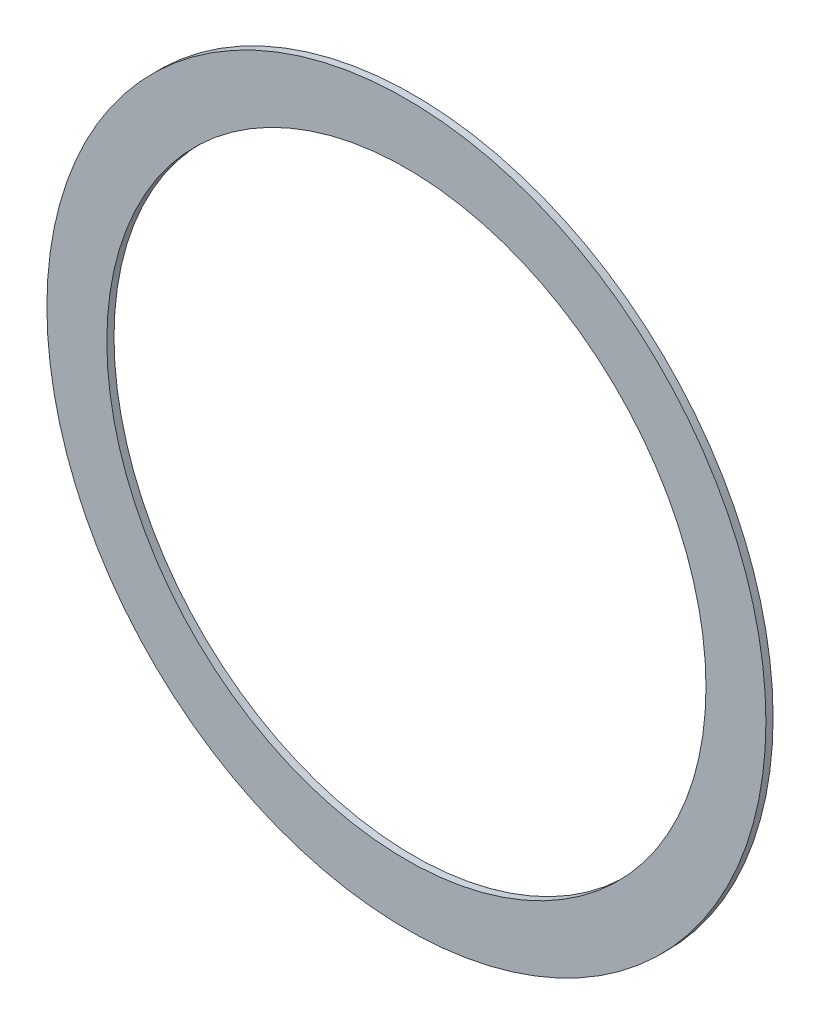
ISO-10303-21;
HEADER;
FILE_DESCRIPTION(('STEP AP214'),'2;1');
FILE_NAME('part.step','',(''),(''),'','','');
FILE_SCHEMA(('AUTOMOTIVE_DESIGN { 1 0 10303 214 1 1 1 1 }'));
ENDSEC;
DATA;
#1=APPLICATION_CONTEXT('core data for automotive mechanical design processes');
#2=APPLICATION_PROTOCOL_DEFINITION('international standard','automotive_design',2000,#1);
#3=PRODUCT_CONTEXT('',#1,'mechanical');
#4=PRODUCT('Part','Part','',(#3));
#5=PRODUCT_RELATED_PRODUCT_CATEGORY('part','',(#4));
#6=PRODUCT_DEFINITION_FORMATION('','',#4);
#7=PRODUCT_DEFINITION_CONTEXT('part definition',#1,'design');
#8=PRODUCT_DEFINITION('design','',#6,#7);
#9=PRODUCT_DEFINITION_SHAPE('','',#8);
#10=(LENGTH_UNIT() NAMED_UNIT(*) SI_UNIT(.MILLI.,.METRE.));
#11=(NAMED_UNIT(*) PLANE_ANGLE_UNIT() SI_UNIT($,.RADIAN.));
#12=(NAMED_UNIT(*) SI_UNIT($,.STERADIAN.) SOLID_ANGLE_UNIT());
#13=UNCERTAINTY_MEASURE_WITH_UNIT(LENGTH_MEASURE(1.E-05),#10,'distance_accuracy_value','');
#14=(GEOMETRIC_REPRESENTATION_CONTEXT(3) GLOBAL_UNCERTAINTY_ASSIGNED_CONTEXT((#13)) GLOBAL_UNIT_ASSIGNED_CONTEXT((#10,
#11,#12)) REPRESENTATION_CONTEXT('',''));
#15=CARTESIAN_POINT('',(0.,0.,0.));
#16=DIRECTION('',(0.,0.,1.));
#17=DIRECTION('',(1.,0.,0.));
#18=AXIS2_PLACEMENT_3D('',#15,#16,#17);
#19=CARTESIAN_POINT('',(0.,0.,0.381));
#20=DIRECTION('',(0.,0.,1.));
#21=DIRECTION('',(1.,0.,0.));
#22=AXIS2_PLACEMENT_3D('',#19,#20,#21);
#23=PLANE('',#22);
#24=CARTESIAN_POINT('',(0.,0.,0.381));
#25=DIRECTION('',(0.,0.,1.));
#26=DIRECTION('',(1.,0.,0.));
#27=AXIS2_PLACEMENT_3D('',#24,#25,#26);
#28=CIRCLE('',#27,19.05);
#29=CARTESIAN_POINT('',(-19.05,0.,0.381));
#30=VERTEX_POINT('',#29);
#31=EDGE_CURVE('E10',#30,#30,#28,.T.);
#32=ORIENTED_EDGE('',*,*,#31,.T.);
#33=EDGE_LOOP('',(#32));
#34=FACE_BOUND('',#33,.T.);
#35=CARTESIAN_POINT('',(0.,0.,0.381));
#36=DIRECTION('',(0.,0.,1.));
#37=DIRECTION('',(1.,0.,0.));
#38=AXIS2_PLACEMENT_3D('',#35,#36,#37);
#39=CIRCLE('',#38,15.875);
#40=CARTESIAN_POINT('',(-15.875,0.,0.381));
#41=VERTEX_POINT('',#40);
#42=EDGE_CURVE('E41',#41,#41,#39,.T.);
#43=ORIENTED_EDGE('',*,*,#42,.F.);
#44=EDGE_LOOP('',(#43));
#45=FACE_BOUND('',#44,.T.);
#46=ADVANCED_FACE('F30',(#34,#45),#23,.T.);
#47=CARTESIAN_POINT('',(0.,0.,0.));
#48=DIRECTION('',(0.,0.,1.));
#49=DIRECTION('',(1.,0.,0.));
#50=AXIS2_PLACEMENT_3D('',#47,#48,#49);
#51=PLANE('',#50);
#52=CARTESIAN_POINT('',(0.,0.,0.));
#53=DIRECTION('',(0.,0.,1.));
#54=DIRECTION('',(1.,0.,0.));
#55=AXIS2_PLACEMENT_3D('',#52,#53,#54);
#56=CIRCLE('',#55,19.05);
#57=CARTESIAN_POINT('',(-19.05,0.,0.));
#58=VERTEX_POINT('',#57);
#59=EDGE_CURVE('E34',#58,#58,#56,.T.);
#60=ORIENTED_EDGE('',*,*,#59,.F.);
#61=EDGE_LOOP('',(#60));
#62=FACE_BOUND('',#61,.T.);
#63=CARTESIAN_POINT('',(0.,0.,0.));
#64=DIRECTION('',(0.,0.,1.));
#65=DIRECTION('',(1.,0.,0.));
#66=AXIS2_PLACEMENT_3D('',#63,#64,#65);
#67=CIRCLE('',#66,15.875);
#68=CARTESIAN_POINT('',(-15.875,0.,0.));
#69=VERTEX_POINT('',#68);
#70=EDGE_CURVE('E43',#69,#69,#67,.T.);
#71=ORIENTED_EDGE('',*,*,#70,.T.);
#72=EDGE_LOOP('',(#71));
#73=FACE_BOUND('',#72,.T.);
#74=ADVANCED_FACE('F53',(#62,#73),#51,.F.);
#75=CARTESIAN_POINT('',(0.,0.,0.381));
#76=DIRECTION('',(0.,0.,-1.));
#77=DIRECTION('',(-1.,0.,0.));
#78=AXIS2_PLACEMENT_3D('',#75,#76,#77);
#79=CYLINDRICAL_SURFACE('',#78,19.05);
#80=CARTESIAN_POINT('',(-19.05,0.,0.381));
#81=CARTESIAN_POINT('',(-19.05,0.,0.37703125));
#82=CARTESIAN_POINT('',(-19.05,0.,0.3730625));
#83=CARTESIAN_POINT('',(-19.05,0.,0.365125));
#84=CARTESIAN_POINT('',(-19.05,0.,0.36115625));
#85=CARTESIAN_POINT('',(-19.05,0.,0.35321875));
#86=CARTESIAN_POINT('',(-19.05,0.,0.34925));
#87=CARTESIAN_POINT('',(-19.05,0.,0.3413125));
#88=CARTESIAN_POINT('',(-19.05,0.,0.33734375));
#89=CARTESIAN_POINT('',(-19.05,0.,0.32940625));
#90=CARTESIAN_POINT('',(-19.05,0.,0.3254375));
#91=CARTESIAN_POINT('',(-19.05,0.,0.3175));
#92=CARTESIAN_POINT('',(-19.05,0.,0.31353125));
#93=CARTESIAN_POINT('',(-19.05,0.,0.30559375));
#94=CARTESIAN_POINT('',(-19.05,0.,0.301625));
#95=CARTESIAN_POINT('',(-19.05,0.,0.2936875));
#96=CARTESIAN_POINT('',(-19.05,0.,0.28971875));
#97=CARTESIAN_POINT('',(-19.05,0.,0.28178125));
#98=CARTESIAN_POINT('',(-19.05,0.,0.2778125));
#99=CARTESIAN_POINT('',(-19.05,0.,0.269875));
#100=CARTESIAN_POINT('',(-19.05,0.,0.26590625));
#101=CARTESIAN_POINT('',(-19.05,0.,0.25796875));
#102=CARTESIAN_POINT('',(-19.05,0.,0.254));
#103=CARTESIAN_POINT('',(-19.05,0.,0.2460625));
#104=CARTESIAN_POINT('',(-19.05,0.,0.24209375));
#105=CARTESIAN_POINT('',(-19.05,0.,0.23415625));
#106=CARTESIAN_POINT('',(-19.05,0.,0.2301875));
#107=CARTESIAN_POINT('',(-19.05,0.,0.22225));
#108=CARTESIAN_POINT('',(-19.05,0.,0.21828125));
#109=CARTESIAN_POINT('',(-19.05,0.,0.21034375));
#110=CARTESIAN_POINT('',(-19.05,0.,0.206375));
#111=CARTESIAN_POINT('',(-19.05,0.,0.1984375));
#112=CARTESIAN_POINT('',(-19.05,0.,0.19446875));
#113=CARTESIAN_POINT('',(-19.05,0.,0.18653125));
#114=CARTESIAN_POINT('',(-19.05,0.,0.1825625));
#115=CARTESIAN_POINT('',(-19.05,0.,0.174625));
#116=CARTESIAN_POINT('',(-19.05,0.,0.17065625));
#117=CARTESIAN_POINT('',(-19.05,0.,0.16271875));
#118=CARTESIAN_POINT('',(-19.05,0.,0.15875));
#119=CARTESIAN_POINT('',(-19.05,0.,0.1508125));
#120=CARTESIAN_POINT('',(-19.05,0.,0.14684375));
#121=CARTESIAN_POINT('',(-19.05,0.,0.13890625));
#122=CARTESIAN_POINT('',(-19.05,0.,0.1349375));
#123=CARTESIAN_POINT('',(-19.05,0.,0.127));
#124=CARTESIAN_POINT('',(-19.05,0.,0.12303125));
#125=CARTESIAN_POINT('',(-19.05,0.,0.11509375));
#126=CARTESIAN_POINT('',(-19.05,0.,0.111125));
#127=CARTESIAN_POINT('',(-19.05,0.,0.1031875));
#128=CARTESIAN_POINT('',(-19.05,0.,0.09921875));
#129=CARTESIAN_POINT('',(-19.05,0.,0.09128125));
#130=CARTESIAN_POINT('',(-19.05,0.,0.0873125));
#131=CARTESIAN_POINT('',(-19.05,0.,0.079375));
#132=CARTESIAN_POINT('',(-19.05,0.,0.07540625));
#133=CARTESIAN_POINT('',(-19.05,0.,0.06746875));
#134=CARTESIAN_POINT('',(-19.05,0.,0.0635));
#135=CARTESIAN_POINT('',(-19.05,0.,0.0555625));
#136=CARTESIAN_POINT('',(-19.05,0.,0.05159375));
#137=CARTESIAN_POINT('',(-19.05,0.,0.04365625));
#138=CARTESIAN_POINT('',(-19.05,0.,0.0396875));
#139=CARTESIAN_POINT('',(-19.05,0.,0.03175));
#140=CARTESIAN_POINT('',(-19.05,0.,0.02778125));
#141=CARTESIAN_POINT('',(-19.05,0.,0.01984375));
#142=CARTESIAN_POINT('',(-19.05,0.,0.015875));
#143=CARTESIAN_POINT('',(-19.05,0.,0.00793749999999999));
#144=CARTESIAN_POINT('',(-19.05,0.,0.00396874999999999));
#145=CARTESIAN_POINT('',(-19.05,0.,0.));
#146=B_SPLINE_CURVE_WITH_KNOTS('',3,(#80,#81,#82,#83,#84,#85,#86,#87,#88,#89,#90,#91,#92,#93,
#94,#95,#96,#97,#98,#99,#100,#101,#102,#103,#104,#105,#106,#107,#108,#109,#110,#111,#112,#113,
#114,#115,#116,#117,#118,#119,#120,#121,#122,#123,#124,#125,#126,#127,#128,#129,#130,#131,#132,
#133,#134,#135,#136,#137,#138,#139,#140,#141,#142,#143,#144,#145),.UNSPECIFIED.,.F.,.F.,(4,2,2,
2,2,2,2,2,2,2,2,2,2,2,2,2,2,2,2,2,2,2,2,2,2,2,2,2,2,2,2,2,4),(0.,0.01190625,0.0238125,
0.0357187499999999,0.047625,0.05953125,0.0714374999999999,0.08334375,0.09525,0.10715625,
0.1190625,0.13096875,0.142875,0.15478125,0.1666875,0.17859375,0.1905,0.20240625,0.2143125,
0.22621875,0.238125,0.25003125,0.2619375,0.27384375,0.28575,0.29765625,0.3095625,0.32146875,
0.333375,0.34528125,0.3571875,0.36909375,0.381),.UNSPECIFIED.);
#147=EDGE_CURVE('BSEAM32',#30,#58,#146,.T.);
#148=ORIENTED_EDGE('',*,*,#31,.F.);
#149=ORIENTED_EDGE('',*,*,#59,.T.);
#150=ORIENTED_EDGE('',*,*,#147,.T.);
#151=ORIENTED_EDGE('',*,*,#147,.F.);
#152=EDGE_LOOP('',(#148,#150,#149,#151));
#153=FACE_BOUND('',#152,.T.);
#154=ADVANCED_FACE('F32',(#153),#79,.T.);
#155=CARTESIAN_POINT('',(0.,0.,0.381));
#156=DIRECTION('',(0.,0.,-1.));
#157=DIRECTION('',(-1.,0.,0.));
#158=AXIS2_PLACEMENT_3D('',#155,#156,#157);
#159=CYLINDRICAL_SURFACE('',#158,15.875);
#160=CARTESIAN_POINT('',(-15.875,0.,0.381));
#161=CARTESIAN_POINT('',(-15.875,0.,0.37703125));
#162=CARTESIAN_POINT('',(-15.875,0.,0.3730625));
#163=CARTESIAN_POINT('',(-15.875,0.,0.365125));
#164=CARTESIAN_POINT('',(-15.875,0.,0.36115625));
#165=CARTESIAN_POINT('',(-15.875,0.,0.35321875));
#166=CARTESIAN_POINT('',(-15.875,0.,0.34925));
#167=CARTESIAN_POINT('',(-15.875,0.,0.3413125));
#168=CARTESIAN_POINT('',(-15.875,0.,0.33734375));
#169=CARTESIAN_POINT('',(-15.875,0.,0.32940625));
#170=CARTESIAN_POINT('',(-15.875,0.,0.3254375));
#171=CARTESIAN_POINT('',(-15.875,0.,0.3175));
#172=CARTESIAN_POINT('',(-15.875,0.,0.31353125));
#173=CARTESIAN_POINT('',(-15.875,0.,0.30559375));
#174=CARTESIAN_POINT('',(-15.875,0.,0.301625));
#175=CARTESIAN_POINT('',(-15.875,0.,0.2936875));
#176=CARTESIAN_POINT('',(-15.875,0.,0.28971875));
#177=CARTESIAN_POINT('',(-15.875,0.,0.28178125));
#178=CARTESIAN_POINT('',(-15.875,0.,0.2778125));
#179=CARTESIAN_POINT('',(-15.875,0.,0.269875));
#180=CARTESIAN_POINT('',(-15.875,0.,0.26590625));
#181=CARTESIAN_POINT('',(-15.875,0.,0.25796875));
#182=CARTESIAN_POINT('',(-15.875,0.,0.254));
#183=CARTESIAN_POINT('',(-15.875,0.,0.2460625));
#184=CARTESIAN_POINT('',(-15.875,0.,0.24209375));
#185=CARTESIAN_POINT('',(-15.875,0.,0.23415625));
#186=CARTESIAN_POINT('',(-15.875,0.,0.2301875));
#187=CARTESIAN_POINT('',(-15.875,0.,0.22225));
#188=CARTESIAN_POINT('',(-15.875,0.,0.21828125));
#189=CARTESIAN_POINT('',(-15.875,0.,0.21034375));
#190=CARTESIAN_POINT('',(-15.875,0.,0.206375));
#191=CARTESIAN_POINT('',(-15.875,0.,0.1984375));
#192=CARTESIAN_POINT('',(-15.875,0.,0.19446875));
#193=CARTESIAN_POINT('',(-15.875,0.,0.18653125));
#194=CARTESIAN_POINT('',(-15.875,0.,0.1825625));
#195=CARTESIAN_POINT('',(-15.875,0.,0.174625));
#196=CARTESIAN_POINT('',(-15.875,0.,0.17065625));
#197=CARTESIAN_POINT('',(-15.875,0.,0.16271875));
#198=CARTESIAN_POINT('',(-15.875,0.,0.15875));
#199=CARTESIAN_POINT('',(-15.875,0.,0.1508125));
#200=CARTESIAN_POINT('',(-15.875,0.,0.14684375));
#201=CARTESIAN_POINT('',(-15.875,0.,0.13890625));
#202=CARTESIAN_POINT('',(-15.875,0.,0.1349375));
#203=CARTESIAN_POINT('',(-15.875,0.,0.127));
#204=CARTESIAN_POINT('',(-15.875,0.,0.12303125));
#205=CARTESIAN_POINT('',(-15.875,0.,0.11509375));
#206=CARTESIAN_POINT('',(-15.875,0.,0.111125));
#207=CARTESIAN_POINT('',(-15.875,0.,0.1031875));
#208=CARTESIAN_POINT('',(-15.875,0.,0.09921875));
#209=CARTESIAN_POINT('',(-15.875,0.,0.09128125));
#210=CARTESIAN_POINT('',(-15.875,0.,0.0873125));
#211=CARTESIAN_POINT('',(-15.875,0.,0.079375));
#212=CARTESIAN_POINT('',(-15.875,0.,0.07540625));
#213=CARTESIAN_POINT('',(-15.875,0.,0.06746875));
#214=CARTESIAN_POINT('',(-15.875,0.,0.0635));
#215=CARTESIAN_POINT('',(-15.875,0.,0.0555625));
#216=CARTESIAN_POINT('',(-15.875,0.,0.05159375));
#217=CARTESIAN_POINT('',(-15.875,0.,0.04365625));
#218=CARTESIAN_POINT('',(-15.875,0.,0.0396875));
#219=CARTESIAN_POINT('',(-15.875,0.,0.03175));
#220=CARTESIAN_POINT('',(-15.875,0.,0.02778125));
#221=CARTESIAN_POINT('',(-15.875,0.,0.01984375));
#222=CARTESIAN_POINT('',(-15.875,0.,0.015875));
#223=CARTESIAN_POINT('',(-15.875,0.,0.00793749999999999));
#224=CARTESIAN_POINT('',(-15.875,0.,0.00396874999999999));
#225=CARTESIAN_POINT('',(-15.875,0.,0.));
#226=B_SPLINE_CURVE_WITH_KNOTS('',3,(#160,#161,#162,#163,#164,#165,#166,#167,#168,#169,#170,
#171,#172,#173,#174,#175,#176,#177,#178,#179,#180,#181,#182,#183,#184,#185,#186,#187,#188,#189,
#190,#191,#192,#193,#194,#195,#196,#197,#198,#199,#200,#201,#202,#203,#204,#205,#206,#207,#208,
#209,#210,#211,#212,#213,#214,#215,#216,#217,#218,#219,#220,#221,#222,#223,#224,#225),
.UNSPECIFIED.,.F.,.F.,(4,2,2,2,2,2,2,2,2,2,2,2,2,2,2,2,2,2,2,2,2,2,2,2,2,2,2,2,2,2,2,2,4),(0.,
0.01190625,0.0238125,0.0357187499999999,0.047625,0.05953125,0.0714374999999999,0.08334375,
0.09525,0.10715625,0.1190625,0.13096875,0.142875,0.15478125,0.1666875,0.17859375,0.1905,
0.20240625,0.2143125,0.22621875,0.238125,0.25003125,0.2619375,0.27384375,0.28575,0.29765625,
0.3095625,0.32146875,0.333375,0.34528125,0.3571875,0.36909375,0.381),.UNSPECIFIED.);
#227=EDGE_CURVE('BSEAM49',#41,#69,#226,.T.);
#228=ORIENTED_EDGE('',*,*,#42,.T.);
#229=ORIENTED_EDGE('',*,*,#70,.F.);
#230=ORIENTED_EDGE('',*,*,#227,.T.);
#231=ORIENTED_EDGE('',*,*,#227,.F.);
#232=EDGE_LOOP('',(#228,#230,#229,#231));
#233=FACE_BOUND('',#232,.T.);
#234=ADVANCED_FACE('F49',(#233),#159,.F.);
#235=CLOSED_SHELL('',(#46,#74,#154,#234));
#236=MANIFOLD_SOLID_BREP('B2',#235);
#237=ADVANCED_BREP_SHAPE_REPRESENTATION('',(#18,#236),#14);
#238=SHAPE_DEFINITION_REPRESENTATION(#9,#237);
ENDSEC;
END-ISO-10303-21;
